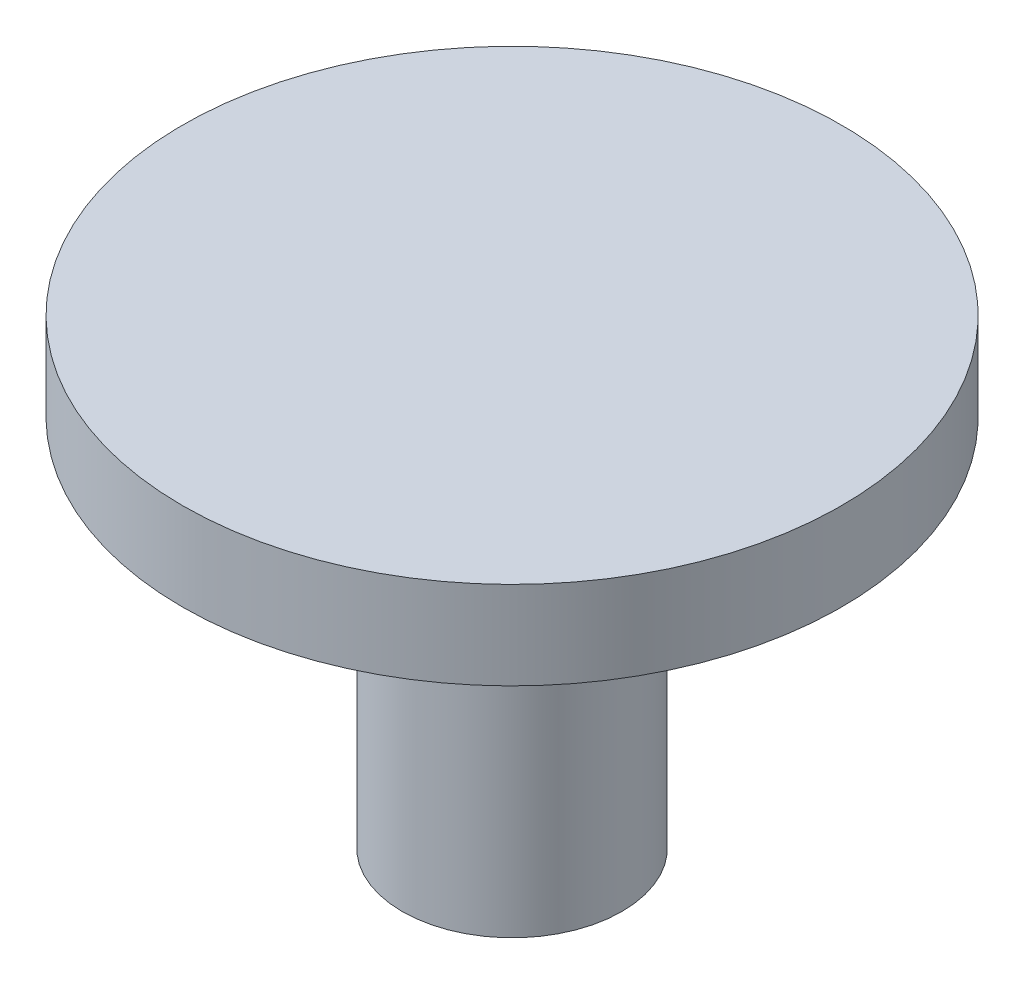
ISO-10303-21;
HEADER;
FILE_DESCRIPTION(('STEP AP214'),'2;1');
FILE_NAME('part.step','',(''),(''),'','','');
FILE_SCHEMA(('AUTOMOTIVE_DESIGN { 1 0 10303 214 1 1 1 1 }'));
ENDSEC;
DATA;
#1=APPLICATION_CONTEXT('core data for automotive mechanical design processes');
#2=APPLICATION_PROTOCOL_DEFINITION('international standard','automotive_design',2000,#1);
#3=PRODUCT_CONTEXT('',#1,'mechanical');
#4=PRODUCT('Part','Part','',(#3));
#5=PRODUCT_RELATED_PRODUCT_CATEGORY('part','',(#4));
#6=PRODUCT_DEFINITION_FORMATION('','',#4);
#7=PRODUCT_DEFINITION_CONTEXT('part definition',#1,'design');
#8=PRODUCT_DEFINITION('design','',#6,#7);
#9=PRODUCT_DEFINITION_SHAPE('','',#8);
#10=(LENGTH_UNIT() NAMED_UNIT(*) SI_UNIT(.MILLI.,.METRE.));
#11=(NAMED_UNIT(*) PLANE_ANGLE_UNIT() SI_UNIT($,.RADIAN.));
#12=(NAMED_UNIT(*) SI_UNIT($,.STERADIAN.) SOLID_ANGLE_UNIT());
#13=UNCERTAINTY_MEASURE_WITH_UNIT(LENGTH_MEASURE(1.E-05),#10,'distance_accuracy_value','');
#14=(GEOMETRIC_REPRESENTATION_CONTEXT(3) GLOBAL_UNCERTAINTY_ASSIGNED_CONTEXT((#13)) GLOBAL_UNIT_ASSIGNED_CONTEXT((#10,
#11,#12)) REPRESENTATION_CONTEXT('',''));
#15=CARTESIAN_POINT('',(0.,0.,0.));
#16=DIRECTION('',(0.,0.,1.));
#17=DIRECTION('',(1.,0.,0.));
#18=AXIS2_PLACEMENT_3D('',#15,#16,#17);
#19=CARTESIAN_POINT('',(0.,0.,0.));
#20=DIRECTION('',(0.,1.,0.));
#21=DIRECTION('',(0.,0.,1.));
#22=AXIS2_PLACEMENT_3D('',#19,#20,#21);
#23=PLANE('',#22);
#24=CARTESIAN_POINT('',(0.,0.,0.));
#25=DIRECTION('',(0.,1.,0.));
#26=DIRECTION('',(0.,0.,1.));
#27=AXIS2_PLACEMENT_3D('',#24,#25,#26);
#28=CIRCLE('',#27,5.);
#29=CARTESIAN_POINT('',(0.,0.,5.));
#30=VERTEX_POINT('',#29);
#31=EDGE_CURVE('E77',#30,#30,#28,.T.);
#32=ORIENTED_EDGE('',*,*,#31,.F.);
#33=EDGE_LOOP('',(#32));
#34=FACE_BOUND('',#33,.T.);
#35=CARTESIAN_POINT('',(0.,0.,0.));
#36=DIRECTION('',(0.,1.,0.));
#37=DIRECTION('',(0.,0.,1.));
#38=AXIS2_PLACEMENT_3D('',#35,#36,#37);
#39=CIRCLE('',#38,3.05);
#40=CARTESIAN_POINT('',(-2.485447742915,0.,-1.767780958501));
#41=VERTEX_POINT('',#40);
#42=CARTESIAN_POINT('',(2.57728719717202,0.,-1.6309784496716));
#43=VERTEX_POINT('',#42);
#44=EDGE_CURVE('E58',#41,#43,#39,.T.);
#45=ORIENTED_EDGE('',*,*,#44,.T.);
#46=DIRECTION('',(-0.999635120050765,0.,-0.0270116041932415));
#47=VECTOR('',#46,1.);
#48=CARTESIAN_POINT('',(2.57728719717202,0.,-1.6309784496716));
#49=LINE('',#48,#47);
#50=EDGE_CURVE('E67',#43,#41,#49,.T.);
#51=ORIENTED_EDGE('',*,*,#50,.T.);
#52=EDGE_LOOP('',(#45,#51));
#53=FACE_BOUND('',#52,.T.);
#54=ADVANCED_FACE('F35',(#34,#53),#23,.F.);
#55=CARTESIAN_POINT('',(0.,9.,0.));
#56=DIRECTION('',(0.,-1.,0.));
#57=DIRECTION('',(0.,0.,-1.));
#58=AXIS2_PLACEMENT_3D('',#55,#56,#57);
#59=CYLINDRICAL_SURFACE('',#58,5.);
#60=CARTESIAN_POINT('',(0.,16.,0.));
#61=DIRECTION('',(0.,1.,0.));
#62=DIRECTION('',(0.,0.,1.));
#63=AXIS2_PLACEMENT_3D('',#60,#61,#62);
#64=CIRCLE('',#63,5.);
#65=CARTESIAN_POINT('',(0.,16.,5.));
#66=VERTEX_POINT('',#65);
#67=EDGE_CURVE('E11',#66,#66,#64,.F.);
#68=ORIENTED_EDGE('',*,*,#67,.T.);
#69=EDGE_LOOP('',(#68));
#70=FACE_BOUND('',#69,.T.);
#71=ORIENTED_EDGE('',*,*,#31,.T.);
#72=EDGE_LOOP('',(#71));
#73=FACE_BOUND('',#72,.T.);
#74=ADVANCED_FACE('F98',(#70,#73),#59,.T.);
#75=CARTESIAN_POINT('',(0.,9.,0.));
#76=DIRECTION('',(0.,-1.,0.));
#77=DIRECTION('',(0.,0.,-1.));
#78=AXIS2_PLACEMENT_3D('',#75,#76,#77);
#79=CYLINDRICAL_SURFACE('',#78,3.05);
#80=ORIENTED_EDGE('',*,*,#44,.F.);
#81=DIRECTION('',(0.,-1.,0.));
#82=VECTOR('',#81,1.);
#83=CARTESIAN_POINT('',(-2.485447742915,9.,-1.767780958501));
#84=LINE('',#83,#82);
#85=CARTESIAN_POINT('',(-2.485447742915,9.,-1.767780958501));
#86=VERTEX_POINT('',#85);
#87=EDGE_CURVE('E71',#86,#41,#84,.T.);
#88=ORIENTED_EDGE('',*,*,#87,.F.);
#89=CARTESIAN_POINT('',(0.,9.,0.));
#90=DIRECTION('',(0.,1.,0.));
#91=DIRECTION('',(0.,0.,1.));
#92=AXIS2_PLACEMENT_3D('',#89,#90,#91);
#93=CIRCLE('',#92,3.05);
#94=CARTESIAN_POINT('',(2.57728719717202,9.,-1.6309784496716));
#95=VERTEX_POINT('',#94);
#96=EDGE_CURVE('E65',#86,#95,#93,.T.);
#97=ORIENTED_EDGE('',*,*,#96,.T.);
#98=DIRECTION('',(0.,-1.,0.));
#99=VECTOR('',#98,1.);
#100=CARTESIAN_POINT('',(2.57728719717202,9.,-1.6309784496716));
#101=LINE('',#100,#99);
#102=EDGE_CURVE('E73',#95,#43,#101,.T.);
#103=ORIENTED_EDGE('',*,*,#102,.T.);
#104=EDGE_LOOP('',(#80,#88,#97,#103));
#105=FACE_BOUND('',#104,.T.);
#106=ADVANCED_FACE('F75',(#105),#79,.F.);
#107=CARTESIAN_POINT('',(2.57728719717202,9.,-1.6309784496716));
#108=DIRECTION('',(-0.0270116041932415,0.,0.999635120050765));
#109=DIRECTION('',(0.999635120050765,0.,0.0270116041932415));
#110=AXIS2_PLACEMENT_3D('',#107,#108,#109);
#111=PLANE('',#110);
#112=ORIENTED_EDGE('',*,*,#50,.F.);
#113=ORIENTED_EDGE('',*,*,#102,.F.);
#114=DIRECTION('',(-0.999635120050765,0.,-0.0270116041932415));
#115=VECTOR('',#114,1.);
#116=CARTESIAN_POINT('',(2.57728719717202,9.,-1.6309784496716));
#117=LINE('',#116,#115);
#118=EDGE_CURVE('E50',#95,#86,#117,.T.);
#119=ORIENTED_EDGE('',*,*,#118,.T.);
#120=ORIENTED_EDGE('',*,*,#87,.T.);
#121=EDGE_LOOP('',(#112,#113,#119,#120));
#122=FACE_BOUND('',#121,.T.);
#123=ADVANCED_FACE('F70',(#122),#111,.T.);
#124=CARTESIAN_POINT('',(0.,9.,0.));
#125=DIRECTION('',(0.,1.,0.));
#126=DIRECTION('',(0.,0.,1.));
#127=AXIS2_PLACEMENT_3D('',#124,#125,#126);
#128=PLANE('',#127);
#129=ORIENTED_EDGE('',*,*,#118,.F.);
#130=ORIENTED_EDGE('',*,*,#96,.F.);
#131=EDGE_LOOP('',(#129,#130));
#132=FACE_BOUND('',#131,.T.);
#133=ADVANCED_FACE('F66',(#132),#128,.F.);
#134=CARTESIAN_POINT('',(0.,21.,0.));
#135=DIRECTION('',(0.,-1.,0.));
#136=DIRECTION('',(0.,0.,-1.));
#137=AXIS2_PLACEMENT_3D('',#134,#135,#136);
#138=CYLINDRICAL_SURFACE('',#137,15.);
#139=CARTESIAN_POINT('',(0.,21.,0.));
#140=DIRECTION('',(0.,1.,0.));
#141=DIRECTION('',(0.,0.,1.));
#142=AXIS2_PLACEMENT_3D('',#139,#140,#141);
#143=CIRCLE('',#142,15.);
#144=CARTESIAN_POINT('',(0.,21.,15.));
#145=VERTEX_POINT('',#144);
#146=EDGE_CURVE('E124',#145,#145,#143,.T.);
#147=ORIENTED_EDGE('',*,*,#146,.F.);
#148=EDGE_LOOP('',(#147));
#149=FACE_BOUND('',#148,.T.);
#150=CARTESIAN_POINT('',(0.,17.,0.));
#151=DIRECTION('',(0.,1.,0.));
#152=DIRECTION('',(0.,0.,1.));
#153=AXIS2_PLACEMENT_3D('',#150,#151,#152);
#154=CIRCLE('',#153,15.);
#155=CARTESIAN_POINT('',(0.,17.,15.));
#156=VERTEX_POINT('',#155);
#157=EDGE_CURVE('E125',#156,#156,#154,.T.);
#158=ORIENTED_EDGE('',*,*,#157,.T.);
#159=EDGE_LOOP('',(#158));
#160=FACE_BOUND('',#159,.T.);
#161=ADVANCED_FACE('F114',(#149,#160),#138,.T.);
#162=CARTESIAN_POINT('',(0.,21.,0.));
#163=DIRECTION('',(0.,1.,0.));
#164=DIRECTION('',(0.,0.,1.));
#165=AXIS2_PLACEMENT_3D('',#162,#163,#164);
#166=PLANE('',#165);
#167=ORIENTED_EDGE('',*,*,#146,.T.);
#168=EDGE_LOOP('',(#167));
#169=FACE_BOUND('',#168,.T.);
#170=ADVANCED_FACE('F94',(#169),#166,.T.);
#171=CARTESIAN_POINT('',(0.,17.,0.));
#172=DIRECTION('',(0.,1.,0.));
#173=DIRECTION('',(0.,0.,1.));
#174=AXIS2_PLACEMENT_3D('',#171,#172,#173);
#175=PLANE('',#174);
#176=CARTESIAN_POINT('',(0.,17.,0.));
#177=DIRECTION('',(0.,1.,0.));
#178=DIRECTION('',(0.,0.,1.));
#179=AXIS2_PLACEMENT_3D('',#176,#177,#178);
#180=CIRCLE('',#179,6.00000000000001);
#181=CARTESIAN_POINT('',(0.,17.,6.00000000000001));
#182=VERTEX_POINT('',#181);
#183=EDGE_CURVE('E44',#182,#182,#180,.T.);
#184=ORIENTED_EDGE('',*,*,#183,.T.);
#185=EDGE_LOOP('',(#184));
#186=FACE_BOUND('',#185,.T.);
#187=ORIENTED_EDGE('',*,*,#157,.F.);
#188=EDGE_LOOP('',(#187));
#189=FACE_BOUND('',#188,.T.);
#190=ADVANCED_FACE('F86',(#186,#189),#175,.F.);
#191=CARTESIAN_POINT('',(0.,17.,0.));
#192=DIRECTION('',(0.,1.,0.));
#193=DIRECTION('',(0.,0.,1.));
#194=AXIS2_PLACEMENT_3D('',#191,#192,#193);
#195=CONICAL_SURFACE('',#194,6.00000000000001,0.785398163397456);
#196=ORIENTED_EDGE('',*,*,#67,.F.);
#197=EDGE_LOOP('',(#196));
#198=FACE_BOUND('',#197,.T.);
#199=ORIENTED_EDGE('',*,*,#183,.F.);
#200=EDGE_LOOP('',(#199));
#201=FACE_BOUND('',#200,.T.);
#202=ADVANCED_FACE('F38',(#198,#201),#195,.T.);
#203=CLOSED_SHELL('',(#54,#74,#106,#123,#133,#161,#170,#190,#202));
#204=MANIFOLD_SOLID_BREP('B2',#203);
#205=ADVANCED_BREP_SHAPE_REPRESENTATION('',(#18,#204),#14);
#206=SHAPE_DEFINITION_REPRESENTATION(#9,#205);
ENDSEC;
END-ISO-10303-21;
